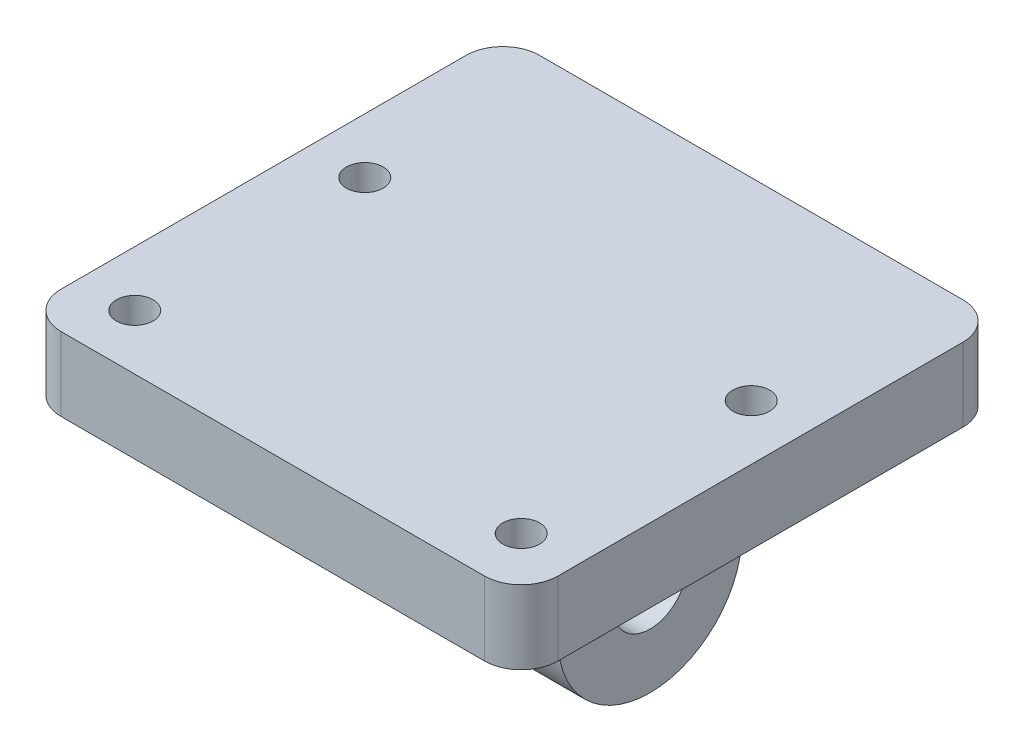
ISO-10303-21;
HEADER;
FILE_DESCRIPTION(('STEP AP214'),'2;1');
FILE_NAME('part.step','',(''),(''),'','','');
FILE_SCHEMA(('AUTOMOTIVE_DESIGN { 1 0 10303 214 1 1 1 1 }'));
ENDSEC;
DATA;
#1=APPLICATION_CONTEXT('core data for automotive mechanical design processes');
#2=APPLICATION_PROTOCOL_DEFINITION('international standard','automotive_design',2000,#1);
#3=PRODUCT_CONTEXT('',#1,'mechanical');
#4=PRODUCT('Part','Part','',(#3));
#5=PRODUCT_RELATED_PRODUCT_CATEGORY('part','',(#4));
#6=PRODUCT_DEFINITION_FORMATION('','',#4);
#7=PRODUCT_DEFINITION_CONTEXT('part definition',#1,'design');
#8=PRODUCT_DEFINITION('design','',#6,#7);
#9=PRODUCT_DEFINITION_SHAPE('','',#8);
#10=(LENGTH_UNIT() NAMED_UNIT(*) SI_UNIT(.MILLI.,.METRE.));
#11=(NAMED_UNIT(*) PLANE_ANGLE_UNIT() SI_UNIT($,.RADIAN.));
#12=(NAMED_UNIT(*) SI_UNIT($,.STERADIAN.) SOLID_ANGLE_UNIT());
#13=UNCERTAINTY_MEASURE_WITH_UNIT(LENGTH_MEASURE(1.E-05),#10,'distance_accuracy_value','');
#14=(GEOMETRIC_REPRESENTATION_CONTEXT(3) GLOBAL_UNCERTAINTY_ASSIGNED_CONTEXT((#13)) GLOBAL_UNIT_ASSIGNED_CONTEXT((#10,
#11,#12)) REPRESENTATION_CONTEXT('',''));
#15=CARTESIAN_POINT('',(0.,0.,0.));
#16=DIRECTION('',(0.,0.,1.));
#17=DIRECTION('',(1.,0.,0.));
#18=AXIS2_PLACEMENT_3D('',#15,#16,#17);
#19=CARTESIAN_POINT('',(0.,0.,0.));
#20=DIRECTION('',(0.,-1.,0.));
#21=DIRECTION('',(0.,0.,-1.));
#22=AXIS2_PLACEMENT_3D('',#19,#20,#21);
#23=PLANE('',#22);
#24=DIRECTION('',(0.,0.,-1.));
#25=VECTOR('',#24,1.);
#26=CARTESIAN_POINT('',(-2.5,0.,0.));
#27=LINE('',#26,#25);
#28=CARTESIAN_POINT('',(-2.5,0.,5.));
#29=VERTEX_POINT('',#28);
#30=CARTESIAN_POINT('',(-2.5,0.,-5.));
#31=VERTEX_POINT('',#30);
#32=EDGE_CURVE('E187',#29,#31,#27,.T.);
#33=ORIENTED_EDGE('',*,*,#32,.T.);
#34=DIRECTION('',(-1.,0.,0.));
#35=VECTOR('',#34,1.);
#36=CARTESIAN_POINT('',(0.,0.,-5.));
#37=LINE('',#36,#35);
#38=CARTESIAN_POINT('',(-7.5,0.,-5.));
#39=VERTEX_POINT('',#38);
#40=EDGE_CURVE('E230',#31,#39,#37,.T.);
#41=ORIENTED_EDGE('',*,*,#40,.T.);
#42=DIRECTION('',(0.,0.,1.));
#43=VECTOR('',#42,1.);
#44=CARTESIAN_POINT('',(-7.5,0.,0.));
#45=LINE('',#44,#43);
#46=CARTESIAN_POINT('',(-7.5,0.,5.));
#47=VERTEX_POINT('',#46);
#48=EDGE_CURVE('E226',#39,#47,#45,.T.);
#49=ORIENTED_EDGE('',*,*,#48,.T.);
#50=DIRECTION('',(-1.,0.,0.));
#51=VECTOR('',#50,1.);
#52=CARTESIAN_POINT('',(0.,0.,5.));
#53=LINE('',#52,#51);
#54=EDGE_CURVE('E222',#29,#47,#53,.T.);
#55=ORIENTED_EDGE('',*,*,#54,.F.);
#56=EDGE_LOOP('',(#33,#41,#49,#55));
#57=FACE_BOUND('',#56,.T.);
#58=CARTESIAN_POINT('',(10.5,0.,-2.5));
#59=DIRECTION('',(0.,1.,0.));
#60=DIRECTION('',(0.,0.,1.));
#61=AXIS2_PLACEMENT_3D('',#58,#59,#60);
#62=CIRCLE('',#61,1.);
#63=CARTESIAN_POINT('',(10.5,0.,-1.5));
#64=VERTEX_POINT('',#63);
#65=EDGE_CURVE('E251',#64,#64,#62,.T.);
#66=ORIENTED_EDGE('',*,*,#65,.T.);
#67=EDGE_LOOP('',(#66));
#68=FACE_BOUND('',#67,.T.);
#69=CARTESIAN_POINT('',(-10.5,0.,-2.5));
#70=DIRECTION('',(0.,1.,0.));
#71=DIRECTION('',(0.,0.,1.));
#72=AXIS2_PLACEMENT_3D('',#69,#70,#71);
#73=CIRCLE('',#72,1.);
#74=CARTESIAN_POINT('',(-10.5,0.,-1.49999999999999));
#75=VERTEX_POINT('',#74);
#76=EDGE_CURVE('E267',#75,#75,#73,.T.);
#77=ORIENTED_EDGE('',*,*,#76,.T.);
#78=EDGE_LOOP('',(#77));
#79=FACE_BOUND('',#78,.T.);
#80=DIRECTION('',(0.,0.,-1.));
#81=VECTOR('',#80,1.);
#82=CARTESIAN_POINT('',(13.5,0.,13.));
#83=LINE('',#82,#81);
#84=CARTESIAN_POINT('',(13.5,0.,11.));
#85=VERTEX_POINT('',#84);
#86=CARTESIAN_POINT('',(13.5,0.,-11.));
#87=VERTEX_POINT('',#86);
#88=EDGE_CURVE('E298',#85,#87,#83,.T.);
#89=ORIENTED_EDGE('',*,*,#88,.F.);
#90=CARTESIAN_POINT('',(11.5,0.,11.));
#91=DIRECTION('',(0.,-1.,0.));
#92=DIRECTION('',(0.,0.,-1.));
#93=AXIS2_PLACEMENT_3D('',#90,#91,#92);
#94=CIRCLE('',#93,2.);
#95=CARTESIAN_POINT('',(11.5,0.,13.));
#96=VERTEX_POINT('',#95);
#97=EDGE_CURVE('E372',#85,#96,#94,.T.);
#98=ORIENTED_EDGE('',*,*,#97,.T.);
#99=DIRECTION('',(1.,0.,0.));
#100=VECTOR('',#99,1.);
#101=CARTESIAN_POINT('',(13.5,0.,13.));
#102=LINE('',#101,#100);
#103=CARTESIAN_POINT('',(-11.5,0.,13.));
#104=VERTEX_POINT('',#103);
#105=EDGE_CURVE('E275',#104,#96,#102,.T.);
#106=ORIENTED_EDGE('',*,*,#105,.F.);
#107=CARTESIAN_POINT('',(-11.5,0.,11.));
#108=DIRECTION('',(0.,-1.,0.));
#109=DIRECTION('',(0.,0.,-1.));
#110=AXIS2_PLACEMENT_3D('',#107,#108,#109);
#111=CIRCLE('',#110,2.);
#112=CARTESIAN_POINT('',(-13.5,0.,11.));
#113=VERTEX_POINT('',#112);
#114=EDGE_CURVE('E369',#104,#113,#111,.T.);
#115=ORIENTED_EDGE('',*,*,#114,.T.);
#116=DIRECTION('',(0.,0.,1.));
#117=VECTOR('',#116,1.);
#118=CARTESIAN_POINT('',(-13.5,0.,13.));
#119=LINE('',#118,#117);
#120=CARTESIAN_POINT('',(-13.5,0.,-11.));
#121=VERTEX_POINT('',#120);
#122=EDGE_CURVE('E284',#121,#113,#119,.T.);
#123=ORIENTED_EDGE('',*,*,#122,.F.);
#124=CARTESIAN_POINT('',(-11.5,0.,-11.));
#125=DIRECTION('',(0.,-1.,0.));
#126=DIRECTION('',(0.,0.,-1.));
#127=AXIS2_PLACEMENT_3D('',#124,#125,#126);
#128=CIRCLE('',#127,2.);
#129=CARTESIAN_POINT('',(-11.5,0.,-13.));
#130=VERTEX_POINT('',#129);
#131=EDGE_CURVE('E366',#121,#130,#128,.T.);
#132=ORIENTED_EDGE('',*,*,#131,.T.);
#133=DIRECTION('',(-1.,0.,0.));
#134=VECTOR('',#133,1.);
#135=CARTESIAN_POINT('',(13.5,0.,-13.));
#136=LINE('',#135,#134);
#137=CARTESIAN_POINT('',(11.5,0.,-13.));
#138=VERTEX_POINT('',#137);
#139=EDGE_CURVE('E302',#138,#130,#136,.T.);
#140=ORIENTED_EDGE('',*,*,#139,.F.);
#141=CARTESIAN_POINT('',(11.5,0.,-11.));
#142=DIRECTION('',(0.,-1.,0.));
#143=DIRECTION('',(0.,0.,-1.));
#144=AXIS2_PLACEMENT_3D('',#141,#142,#143);
#145=CIRCLE('',#144,2.);
#146=EDGE_CURVE('E363',#138,#87,#145,.T.);
#147=ORIENTED_EDGE('',*,*,#146,.T.);
#148=EDGE_LOOP('',(#89,#98,#106,#115,#123,#132,#140,#147));
#149=FACE_BOUND('',#148,.T.);
#150=CARTESIAN_POINT('',(-10.5,0.,10.));
#151=DIRECTION('',(0.,1.,0.));
#152=DIRECTION('',(0.,0.,1.));
#153=AXIS2_PLACEMENT_3D('',#150,#151,#152);
#154=CIRCLE('',#153,1.);
#155=CARTESIAN_POINT('',(-10.5,0.,11.));
#156=VERTEX_POINT('',#155);
#157=EDGE_CURVE('E259',#156,#156,#154,.T.);
#158=ORIENTED_EDGE('',*,*,#157,.T.);
#159=EDGE_LOOP('',(#158));
#160=FACE_BOUND('',#159,.T.);
#161=CARTESIAN_POINT('',(10.5,0.,10.));
#162=DIRECTION('',(0.,1.,0.));
#163=DIRECTION('',(0.,0.,1.));
#164=AXIS2_PLACEMENT_3D('',#161,#162,#163);
#165=CIRCLE('',#164,1.);
#166=CARTESIAN_POINT('',(10.5,0.,11.));
#167=VERTEX_POINT('',#166);
#168=EDGE_CURVE('E246',#167,#167,#165,.T.);
#169=ORIENTED_EDGE('',*,*,#168,.T.);
#170=EDGE_LOOP('',(#169));
#171=FACE_BOUND('',#170,.T.);
#172=DIRECTION('',(0.,0.,-1.));
#173=VECTOR('',#172,1.);
#174=CARTESIAN_POINT('',(2.5,0.,0.));
#175=LINE('',#174,#173);
#176=CARTESIAN_POINT('',(2.5,0.,5.));
#177=VERTEX_POINT('',#176);
#178=CARTESIAN_POINT('',(2.5,0.,-5.));
#179=VERTEX_POINT('',#178);
#180=EDGE_CURVE('E179',#177,#179,#175,.T.);
#181=ORIENTED_EDGE('',*,*,#180,.F.);
#182=DIRECTION('',(-1.,0.,0.));
#183=VECTOR('',#182,1.);
#184=CARTESIAN_POINT('',(0.,0.,5.));
#185=LINE('',#184,#183);
#186=CARTESIAN_POINT('',(7.5,0.,5.));
#187=VERTEX_POINT('',#186);
#188=EDGE_CURVE('E191',#187,#177,#185,.T.);
#189=ORIENTED_EDGE('',*,*,#188,.F.);
#190=DIRECTION('',(0.,0.,1.));
#191=VECTOR('',#190,1.);
#192=CARTESIAN_POINT('',(7.5,0.,0.));
#193=LINE('',#192,#191);
#194=CARTESIAN_POINT('',(7.5,0.,-5.));
#195=VERTEX_POINT('',#194);
#196=EDGE_CURVE('E206',#195,#187,#193,.T.);
#197=ORIENTED_EDGE('',*,*,#196,.F.);
#198=DIRECTION('',(-1.,0.,0.));
#199=VECTOR('',#198,1.);
#200=CARTESIAN_POINT('',(0.,0.,-5.));
#201=LINE('',#200,#199);
#202=EDGE_CURVE('E202',#195,#179,#201,.T.);
#203=ORIENTED_EDGE('',*,*,#202,.T.);
#204=EDGE_LOOP('',(#181,#189,#197,#203));
#205=FACE_BOUND('',#204,.T.);
#206=ADVANCED_FACE('F47',(#57,#68,#79,#149,#160,#171,#205),#23,.T.);
#207=CARTESIAN_POINT('',(0.,4.,0.));
#208=DIRECTION('',(0.,-1.,0.));
#209=DIRECTION('',(0.,0.,-1.));
#210=AXIS2_PLACEMENT_3D('',#207,#208,#209);
#211=PLANE('',#210);
#212=DIRECTION('',(1.,0.,0.));
#213=VECTOR('',#212,1.);
#214=CARTESIAN_POINT('',(13.5,4.,13.));
#215=LINE('',#214,#213);
#216=CARTESIAN_POINT('',(-11.5,4.,13.));
#217=VERTEX_POINT('',#216);
#218=CARTESIAN_POINT('',(11.5,4.,13.));
#219=VERTEX_POINT('',#218);
#220=EDGE_CURVE('E279',#217,#219,#215,.T.);
#221=ORIENTED_EDGE('',*,*,#220,.T.);
#222=CARTESIAN_POINT('',(11.5,4.,11.));
#223=DIRECTION('',(0.,-1.,0.));
#224=DIRECTION('',(0.,0.,-1.));
#225=AXIS2_PLACEMENT_3D('',#222,#223,#224);
#226=CIRCLE('',#225,2.);
#227=CARTESIAN_POINT('',(13.5,4.,11.));
#228=VERTEX_POINT('',#227);
#229=EDGE_CURVE('E390',#219,#228,#226,.F.);
#230=ORIENTED_EDGE('',*,*,#229,.T.);
#231=DIRECTION('',(0.,0.,-1.));
#232=VECTOR('',#231,1.);
#233=CARTESIAN_POINT('',(13.5,4.,13.));
#234=LINE('',#233,#232);
#235=CARTESIAN_POINT('',(13.5,4.,-11.));
#236=VERTEX_POINT('',#235);
#237=EDGE_CURVE('E283',#228,#236,#234,.T.);
#238=ORIENTED_EDGE('',*,*,#237,.T.);
#239=CARTESIAN_POINT('',(11.5,4.,-11.));
#240=DIRECTION('',(0.,-1.,0.));
#241=DIRECTION('',(0.,0.,-1.));
#242=AXIS2_PLACEMENT_3D('',#239,#240,#241);
#243=CIRCLE('',#242,2.);
#244=CARTESIAN_POINT('',(11.5,4.,-13.));
#245=VERTEX_POINT('',#244);
#246=EDGE_CURVE('E382',#236,#245,#243,.F.);
#247=ORIENTED_EDGE('',*,*,#246,.T.);
#248=DIRECTION('',(-1.,0.,0.));
#249=VECTOR('',#248,1.);
#250=CARTESIAN_POINT('',(13.5,4.,-13.));
#251=LINE('',#250,#249);
#252=CARTESIAN_POINT('',(-11.5,4.,-13.));
#253=VERTEX_POINT('',#252);
#254=EDGE_CURVE('E288',#245,#253,#251,.T.);
#255=ORIENTED_EDGE('',*,*,#254,.T.);
#256=CARTESIAN_POINT('',(-11.5,4.,-11.));
#257=DIRECTION('',(0.,-1.,0.));
#258=DIRECTION('',(0.,0.,-1.));
#259=AXIS2_PLACEMENT_3D('',#256,#257,#258);
#260=CIRCLE('',#259,2.);
#261=CARTESIAN_POINT('',(-13.5,4.,-11.));
#262=VERTEX_POINT('',#261);
#263=EDGE_CURVE('E70',#253,#262,#260,.F.);
#264=ORIENTED_EDGE('',*,*,#263,.T.);
#265=DIRECTION('',(0.,0.,1.));
#266=VECTOR('',#265,1.);
#267=CARTESIAN_POINT('',(-13.5,4.,13.));
#268=LINE('',#267,#266);
#269=CARTESIAN_POINT('',(-13.5,4.,11.));
#270=VERTEX_POINT('',#269);
#271=EDGE_CURVE('E291',#262,#270,#268,.T.);
#272=ORIENTED_EDGE('',*,*,#271,.T.);
#273=CARTESIAN_POINT('',(-11.5,4.,11.));
#274=DIRECTION('',(0.,-1.,0.));
#275=DIRECTION('',(0.,0.,-1.));
#276=AXIS2_PLACEMENT_3D('',#273,#274,#275);
#277=CIRCLE('',#276,2.);
#278=EDGE_CURVE('E387',#270,#217,#277,.F.);
#279=ORIENTED_EDGE('',*,*,#278,.T.);
#280=EDGE_LOOP('',(#221,#230,#238,#247,#255,#264,#272,#279));
#281=FACE_BOUND('',#280,.T.);
#282=CARTESIAN_POINT('',(-10.5,4.,-2.5));
#283=DIRECTION('',(0.,1.,0.));
#284=DIRECTION('',(0.,0.,1.));
#285=AXIS2_PLACEMENT_3D('',#282,#283,#284);
#286=CIRCLE('',#285,1.);
#287=CARTESIAN_POINT('',(-10.5,4.,-1.49999999999999));
#288=VERTEX_POINT('',#287);
#289=EDGE_CURVE('E271',#288,#288,#286,.T.);
#290=ORIENTED_EDGE('',*,*,#289,.F.);
#291=EDGE_LOOP('',(#290));
#292=FACE_BOUND('',#291,.T.);
#293=CARTESIAN_POINT('',(-10.5,4.,10.));
#294=DIRECTION('',(0.,1.,0.));
#295=DIRECTION('',(0.,0.,1.));
#296=AXIS2_PLACEMENT_3D('',#293,#294,#295);
#297=CIRCLE('',#296,1.);
#298=CARTESIAN_POINT('',(-10.5,4.,11.));
#299=VERTEX_POINT('',#298);
#300=EDGE_CURVE('E263',#299,#299,#297,.T.);
#301=ORIENTED_EDGE('',*,*,#300,.F.);
#302=EDGE_LOOP('',(#301));
#303=FACE_BOUND('',#302,.T.);
#304=CARTESIAN_POINT('',(10.5,4.,-2.5));
#305=DIRECTION('',(0.,1.,0.));
#306=DIRECTION('',(0.,0.,1.));
#307=AXIS2_PLACEMENT_3D('',#304,#305,#306);
#308=CIRCLE('',#307,1.);
#309=CARTESIAN_POINT('',(10.5,4.,-1.5));
#310=VERTEX_POINT('',#309);
#311=EDGE_CURVE('E255',#310,#310,#308,.T.);
#312=ORIENTED_EDGE('',*,*,#311,.F.);
#313=EDGE_LOOP('',(#312));
#314=FACE_BOUND('',#313,.T.);
#315=CARTESIAN_POINT('',(10.5,4.,10.));
#316=DIRECTION('',(0.,1.,0.));
#317=DIRECTION('',(0.,0.,1.));
#318=AXIS2_PLACEMENT_3D('',#315,#316,#317);
#319=CIRCLE('',#318,1.);
#320=CARTESIAN_POINT('',(10.5,4.,11.));
#321=VERTEX_POINT('',#320);
#322=EDGE_CURVE('E247',#321,#321,#319,.T.);
#323=ORIENTED_EDGE('',*,*,#322,.F.);
#324=EDGE_LOOP('',(#323));
#325=FACE_BOUND('',#324,.T.);
#326=ADVANCED_FACE('F417',(#281,#292,#303,#314,#325),#211,.F.);
#327=CARTESIAN_POINT('',(13.5,4.,13.));
#328=DIRECTION('',(0.,0.,-1.));
#329=DIRECTION('',(-1.,0.,0.));
#330=AXIS2_PLACEMENT_3D('',#327,#328,#329);
#331=PLANE('',#330);
#332=ORIENTED_EDGE('',*,*,#105,.T.);
#333=DIRECTION('',(0.,-1.,0.));
#334=VECTOR('',#333,1.);
#335=CARTESIAN_POINT('',(11.5,4.,13.));
#336=LINE('',#335,#334);
#337=EDGE_CURVE('E379',#96,#219,#336,.F.);
#338=ORIENTED_EDGE('',*,*,#337,.T.);
#339=ORIENTED_EDGE('',*,*,#220,.F.);
#340=DIRECTION('',(0.,-1.,0.));
#341=VECTOR('',#340,1.);
#342=CARTESIAN_POINT('',(-11.5,4.,13.));
#343=LINE('',#342,#341);
#344=EDGE_CURVE('E375',#217,#104,#343,.T.);
#345=ORIENTED_EDGE('',*,*,#344,.T.);
#346=EDGE_LOOP('',(#332,#338,#339,#345));
#347=FACE_BOUND('',#346,.T.);
#348=ADVANCED_FACE('F425',(#347),#331,.F.);
#349=CARTESIAN_POINT('',(13.5,4.,13.));
#350=DIRECTION('',(-1.,0.,0.));
#351=DIRECTION('',(0.,0.,1.));
#352=AXIS2_PLACEMENT_3D('',#349,#350,#351);
#353=PLANE('',#352);
#354=ORIENTED_EDGE('',*,*,#237,.F.);
#355=DIRECTION('',(0.,-1.,0.));
#356=VECTOR('',#355,1.);
#357=CARTESIAN_POINT('',(13.5,4.,11.));
#358=LINE('',#357,#356);
#359=EDGE_CURVE('E359',#228,#85,#358,.T.);
#360=ORIENTED_EDGE('',*,*,#359,.T.);
#361=ORIENTED_EDGE('',*,*,#88,.T.);
#362=DIRECTION('',(0.,-1.,0.));
#363=VECTOR('',#362,1.);
#364=CARTESIAN_POINT('',(13.5,4.,-11.));
#365=LINE('',#364,#363);
#366=EDGE_CURVE('E343',#87,#236,#365,.F.);
#367=ORIENTED_EDGE('',*,*,#366,.T.);
#368=EDGE_LOOP('',(#354,#360,#361,#367));
#369=FACE_BOUND('',#368,.T.);
#370=ADVANCED_FACE('F433',(#369),#353,.F.);
#371=CARTESIAN_POINT('',(13.5,4.,-13.));
#372=DIRECTION('',(0.,0.,1.));
#373=DIRECTION('',(1.,0.,0.));
#374=AXIS2_PLACEMENT_3D('',#371,#372,#373);
#375=PLANE('',#374);
#376=ORIENTED_EDGE('',*,*,#139,.T.);
#377=DIRECTION('',(0.,-1.,0.));
#378=VECTOR('',#377,1.);
#379=CARTESIAN_POINT('',(-11.5,4.,-13.));
#380=LINE('',#379,#378);
#381=EDGE_CURVE('E11',#130,#253,#380,.F.);
#382=ORIENTED_EDGE('',*,*,#381,.T.);
#383=ORIENTED_EDGE('',*,*,#254,.F.);
#384=DIRECTION('',(0.,-1.,0.));
#385=VECTOR('',#384,1.);
#386=CARTESIAN_POINT('',(11.5,4.,-13.));
#387=LINE('',#386,#385);
#388=EDGE_CURVE('E56',#245,#138,#387,.T.);
#389=ORIENTED_EDGE('',*,*,#388,.T.);
#390=EDGE_LOOP('',(#376,#382,#383,#389));
#391=FACE_BOUND('',#390,.T.);
#392=ADVANCED_FACE('F404',(#391),#375,.F.);
#393=CARTESIAN_POINT('',(-13.5,4.,13.));
#394=DIRECTION('',(1.,0.,0.));
#395=DIRECTION('',(0.,0.,-1.));
#396=AXIS2_PLACEMENT_3D('',#393,#394,#395);
#397=PLANE('',#396);
#398=ORIENTED_EDGE('',*,*,#122,.T.);
#399=DIRECTION('',(0.,-1.,0.));
#400=VECTOR('',#399,1.);
#401=CARTESIAN_POINT('',(-13.5,4.,11.));
#402=LINE('',#401,#400);
#403=EDGE_CURVE('E63',#113,#270,#402,.F.);
#404=ORIENTED_EDGE('',*,*,#403,.T.);
#405=ORIENTED_EDGE('',*,*,#271,.F.);
#406=DIRECTION('',(0.,-1.,0.));
#407=VECTOR('',#406,1.);
#408=CARTESIAN_POINT('',(-13.5,4.,-11.));
#409=LINE('',#408,#407);
#410=EDGE_CURVE('E393',#262,#121,#409,.T.);
#411=ORIENTED_EDGE('',*,*,#410,.T.);
#412=EDGE_LOOP('',(#398,#404,#405,#411));
#413=FACE_BOUND('',#412,.T.);
#414=ADVANCED_FACE('F415',(#413),#397,.F.);
#415=CARTESIAN_POINT('',(-10.5,4.,-2.5));
#416=DIRECTION('',(0.,-1.,0.));
#417=DIRECTION('',(0.,0.,-1.));
#418=AXIS2_PLACEMENT_3D('',#415,#416,#417);
#419=CYLINDRICAL_SURFACE('',#418,1.);
#420=ORIENTED_EDGE('',*,*,#289,.T.);
#421=EDGE_LOOP('',(#420));
#422=FACE_BOUND('',#421,.T.);
#423=ORIENTED_EDGE('',*,*,#76,.F.);
#424=EDGE_LOOP('',(#423));
#425=FACE_BOUND('',#424,.T.);
#426=ADVANCED_FACE('F453',(#422,#425),#419,.F.);
#427=CARTESIAN_POINT('',(-10.5,4.,10.));
#428=DIRECTION('',(0.,-1.,0.));
#429=DIRECTION('',(0.,0.,-1.));
#430=AXIS2_PLACEMENT_3D('',#427,#428,#429);
#431=CYLINDRICAL_SURFACE('',#430,1.);
#432=ORIENTED_EDGE('',*,*,#300,.T.);
#433=EDGE_LOOP('',(#432));
#434=FACE_BOUND('',#433,.T.);
#435=ORIENTED_EDGE('',*,*,#157,.F.);
#436=EDGE_LOOP('',(#435));
#437=FACE_BOUND('',#436,.T.);
#438=ADVANCED_FACE('F625',(#434,#437),#431,.F.);
#439=CARTESIAN_POINT('',(10.5,4.,-2.5));
#440=DIRECTION('',(0.,-1.,0.));
#441=DIRECTION('',(0.,0.,-1.));
#442=AXIS2_PLACEMENT_3D('',#439,#440,#441);
#443=CYLINDRICAL_SURFACE('',#442,1.);
#444=ORIENTED_EDGE('',*,*,#311,.T.);
#445=EDGE_LOOP('',(#444));
#446=FACE_BOUND('',#445,.T.);
#447=ORIENTED_EDGE('',*,*,#65,.F.);
#448=EDGE_LOOP('',(#447));
#449=FACE_BOUND('',#448,.T.);
#450=ADVANCED_FACE('F616',(#446,#449),#443,.F.);
#451=CARTESIAN_POINT('',(10.5,4.,10.));
#452=DIRECTION('',(0.,-1.,0.));
#453=DIRECTION('',(0.,0.,-1.));
#454=AXIS2_PLACEMENT_3D('',#451,#452,#453);
#455=CYLINDRICAL_SURFACE('',#454,1.);
#456=ORIENTED_EDGE('',*,*,#322,.T.);
#457=EDGE_LOOP('',(#456));
#458=FACE_BOUND('',#457,.T.);
#459=ORIENTED_EDGE('',*,*,#168,.F.);
#460=EDGE_LOOP('',(#459));
#461=FACE_BOUND('',#460,.T.);
#462=ADVANCED_FACE('F602',(#458,#461),#455,.F.);
#463=CARTESIAN_POINT('',(-2.5,-10.,0.));
#464=DIRECTION('',(1.,0.,0.));
#465=DIRECTION('',(0.,0.,-1.));
#466=AXIS2_PLACEMENT_3D('',#463,#464,#465);
#467=PLANE('',#466);
#468=CARTESIAN_POINT('',(-2.5,-5.,0.));
#469=DIRECTION('',(1.,0.,0.));
#470=DIRECTION('',(0.,0.,-1.));
#471=AXIS2_PLACEMENT_3D('',#468,#469,#470);
#472=CIRCLE('',#471,2.);
#473=CARTESIAN_POINT('',(-2.5,-5.,-2.));
#474=VERTEX_POINT('',#473);
#475=EDGE_CURVE('E351',#474,#474,#472,.F.);
#476=ORIENTED_EDGE('',*,*,#475,.T.);
#477=EDGE_LOOP('',(#476));
#478=FACE_BOUND('',#477,.T.);
#479=DIRECTION('',(0.,1.,0.));
#480=VECTOR('',#479,1.);
#481=CARTESIAN_POINT('',(-2.5,-10.,5.));
#482=LINE('',#481,#480);
#483=CARTESIAN_POINT('',(-2.5,-5.,5.));
#484=VERTEX_POINT('',#483);
#485=EDGE_CURVE('E243',#484,#29,#482,.T.);
#486=ORIENTED_EDGE('',*,*,#485,.F.);
#487=CARTESIAN_POINT('',(-2.5,-5.,0.));
#488=DIRECTION('',(1.,0.,0.));
#489=DIRECTION('',(0.,0.,-1.));
#490=AXIS2_PLACEMENT_3D('',#487,#488,#489);
#491=CIRCLE('',#490,5.);
#492=CARTESIAN_POINT('',(-2.5,-10.,0.));
#493=VERTEX_POINT('',#492);
#494=EDGE_CURVE('E337',#484,#493,#491,.T.);
#495=ORIENTED_EDGE('',*,*,#494,.T.);
#496=CARTESIAN_POINT('',(-2.5,-5.,0.));
#497=DIRECTION('',(1.,0.,0.));
#498=DIRECTION('',(0.,0.,-1.));
#499=AXIS2_PLACEMENT_3D('',#496,#497,#498);
#500=CIRCLE('',#499,5.);
#501=CARTESIAN_POINT('',(-2.5,-5.,-5.));
#502=VERTEX_POINT('',#501);
#503=EDGE_CURVE('E334',#493,#502,#500,.T.);
#504=ORIENTED_EDGE('',*,*,#503,.T.);
#505=DIRECTION('',(0.,1.,0.));
#506=VECTOR('',#505,1.);
#507=CARTESIAN_POINT('',(-2.5,-10.,-5.));
#508=LINE('',#507,#506);
#509=EDGE_CURVE('E234',#502,#31,#508,.T.);
#510=ORIENTED_EDGE('',*,*,#509,.T.);
#511=ORIENTED_EDGE('',*,*,#32,.F.);
#512=EDGE_LOOP('',(#486,#495,#504,#510,#511));
#513=FACE_BOUND('',#512,.T.);
#514=ADVANCED_FACE('F594',(#478,#513),#467,.T.);
#515=CARTESIAN_POINT('',(0.,-10.,5.));
#516=DIRECTION('',(0.,0.,-1.));
#517=DIRECTION('',(-1.,0.,0.));
#518=AXIS2_PLACEMENT_3D('',#515,#516,#517);
#519=PLANE('',#518);
#520=DIRECTION('',(0.,1.,0.));
#521=VECTOR('',#520,1.);
#522=CARTESIAN_POINT('',(-7.5,-10.,5.));
#523=LINE('',#522,#521);
#524=CARTESIAN_POINT('',(-7.5,-5.,5.));
#525=VERTEX_POINT('',#524);
#526=EDGE_CURVE('E240',#525,#47,#523,.T.);
#527=ORIENTED_EDGE('',*,*,#526,.F.);
#528=DIRECTION('',(-1.,0.,0.));
#529=VECTOR('',#528,1.);
#530=CARTESIAN_POINT('',(-2.5,-5.,5.));
#531=LINE('',#530,#529);
#532=EDGE_CURVE('E330',#525,#484,#531,.F.);
#533=ORIENTED_EDGE('',*,*,#532,.T.);
#534=ORIENTED_EDGE('',*,*,#485,.T.);
#535=ORIENTED_EDGE('',*,*,#54,.T.);
#536=EDGE_LOOP('',(#527,#533,#534,#535));
#537=FACE_BOUND('',#536,.T.);
#538=ADVANCED_FACE('F585',(#537),#519,.F.);
#539=CARTESIAN_POINT('',(-7.5,-10.,0.));
#540=DIRECTION('',(-1.,0.,0.));
#541=DIRECTION('',(0.,0.,1.));
#542=AXIS2_PLACEMENT_3D('',#539,#540,#541);
#543=PLANE('',#542);
#544=CARTESIAN_POINT('',(-7.5,-5.,0.));
#545=DIRECTION('',(-1.,0.,0.));
#546=DIRECTION('',(0.,0.,1.));
#547=AXIS2_PLACEMENT_3D('',#544,#545,#546);
#548=CIRCLE('',#547,2.);
#549=CARTESIAN_POINT('',(-7.5,-5.,2.));
#550=VERTEX_POINT('',#549);
#551=EDGE_CURVE('E729',#550,#550,#548,.F.);
#552=ORIENTED_EDGE('',*,*,#551,.T.);
#553=EDGE_LOOP('',(#552));
#554=FACE_BOUND('',#553,.T.);
#555=CARTESIAN_POINT('',(-7.5,-5.,0.));
#556=DIRECTION('',(-1.,0.,0.));
#557=DIRECTION('',(0.,0.,1.));
#558=AXIS2_PLACEMENT_3D('',#555,#556,#557);
#559=CIRCLE('',#558,5.);
#560=CARTESIAN_POINT('',(-7.5,-5.,-5.));
#561=VERTEX_POINT('',#560);
#562=CARTESIAN_POINT('',(-7.5,-10.,0.));
#563=VERTEX_POINT('',#562);
#564=EDGE_CURVE('E324',#561,#563,#559,.T.);
#565=ORIENTED_EDGE('',*,*,#564,.T.);
#566=CARTESIAN_POINT('',(-7.5,-5.,0.));
#567=DIRECTION('',(-1.,0.,0.));
#568=DIRECTION('',(0.,0.,1.));
#569=AXIS2_PLACEMENT_3D('',#566,#567,#568);
#570=CIRCLE('',#569,5.);
#571=EDGE_CURVE('E327',#563,#525,#570,.T.);
#572=ORIENTED_EDGE('',*,*,#571,.T.);
#573=ORIENTED_EDGE('',*,*,#526,.T.);
#574=ORIENTED_EDGE('',*,*,#48,.F.);
#575=DIRECTION('',(0.,1.,0.));
#576=VECTOR('',#575,1.);
#577=CARTESIAN_POINT('',(-7.5,-10.,-5.));
#578=LINE('',#577,#576);
#579=EDGE_CURVE('E237',#561,#39,#578,.T.);
#580=ORIENTED_EDGE('',*,*,#579,.F.);
#581=EDGE_LOOP('',(#565,#572,#573,#574,#580));
#582=FACE_BOUND('',#581,.T.);
#583=ADVANCED_FACE('F576',(#554,#582),#543,.T.);
#584=CARTESIAN_POINT('',(0.,-10.,-5.));
#585=DIRECTION('',(0.,0.,-1.));
#586=DIRECTION('',(-1.,0.,0.));
#587=AXIS2_PLACEMENT_3D('',#584,#585,#586);
#588=PLANE('',#587);
#589=ORIENTED_EDGE('',*,*,#509,.F.);
#590=DIRECTION('',(-1.,0.,0.));
#591=VECTOR('',#590,1.);
#592=CARTESIAN_POINT('',(0.,-5.,-5.));
#593=LINE('',#592,#591);
#594=EDGE_CURVE('E340',#502,#561,#593,.T.);
#595=ORIENTED_EDGE('',*,*,#594,.T.);
#596=ORIENTED_EDGE('',*,*,#579,.T.);
#597=ORIENTED_EDGE('',*,*,#40,.F.);
#598=EDGE_LOOP('',(#589,#595,#596,#597));
#599=FACE_BOUND('',#598,.T.);
#600=ADVANCED_FACE('F568',(#599),#588,.T.);
#601=CARTESIAN_POINT('',(0.,-10.,5.));
#602=DIRECTION('',(0.,0.,-1.));
#603=DIRECTION('',(-1.,0.,0.));
#604=AXIS2_PLACEMENT_3D('',#601,#602,#603);
#605=PLANE('',#604);
#606=DIRECTION('',(0.,1.,0.));
#607=VECTOR('',#606,1.);
#608=CARTESIAN_POINT('',(2.5,-10.,5.));
#609=LINE('',#608,#607);
#610=CARTESIAN_POINT('',(2.5,-5.,5.));
#611=VERTEX_POINT('',#610);
#612=EDGE_CURVE('E174',#611,#177,#609,.T.);
#613=ORIENTED_EDGE('',*,*,#612,.F.);
#614=DIRECTION('',(-1.,0.,0.));
#615=VECTOR('',#614,1.);
#616=CARTESIAN_POINT('',(7.5,-5.,5.));
#617=LINE('',#616,#615);
#618=CARTESIAN_POINT('',(7.5,-5.,5.));
#619=VERTEX_POINT('',#618);
#620=EDGE_CURVE('E312',#611,#619,#617,.F.);
#621=ORIENTED_EDGE('',*,*,#620,.T.);
#622=DIRECTION('',(0.,1.,0.));
#623=VECTOR('',#622,1.);
#624=CARTESIAN_POINT('',(7.5,-10.,5.));
#625=LINE('',#624,#623);
#626=EDGE_CURVE('E194',#619,#187,#625,.T.);
#627=ORIENTED_EDGE('',*,*,#626,.T.);
#628=ORIENTED_EDGE('',*,*,#188,.T.);
#629=EDGE_LOOP('',(#613,#621,#627,#628));
#630=FACE_BOUND('',#629,.T.);
#631=ADVANCED_FACE('F192',(#630),#605,.F.);
#632=CARTESIAN_POINT('',(2.5,-10.,0.));
#633=DIRECTION('',(1.,0.,0.));
#634=DIRECTION('',(0.,0.,-1.));
#635=AXIS2_PLACEMENT_3D('',#632,#633,#634);
#636=PLANE('',#635);
#637=CARTESIAN_POINT('',(2.5,-5.,0.));
#638=DIRECTION('',(1.,0.,0.));
#639=DIRECTION('',(0.,0.,-1.));
#640=AXIS2_PLACEMENT_3D('',#637,#638,#639);
#641=CIRCLE('',#640,2.);
#642=CARTESIAN_POINT('',(2.5,-5.,-2.));
#643=VERTEX_POINT('',#642);
#644=EDGE_CURVE('E356',#643,#643,#641,.F.);
#645=ORIENTED_EDGE('',*,*,#644,.F.);
#646=EDGE_LOOP('',(#645));
#647=FACE_BOUND('',#646,.T.);
#648=CARTESIAN_POINT('',(2.5,-5.,0.));
#649=DIRECTION('',(1.,0.,0.));
#650=DIRECTION('',(0.,0.,-1.));
#651=AXIS2_PLACEMENT_3D('',#648,#649,#650);
#652=CIRCLE('',#651,5.);
#653=CARTESIAN_POINT('',(2.5,-5.,-5.));
#654=VERTEX_POINT('',#653);
#655=CARTESIAN_POINT('',(2.5,-10.,0.));
#656=VERTEX_POINT('',#655);
#657=EDGE_CURVE('E294',#654,#656,#652,.F.);
#658=ORIENTED_EDGE('',*,*,#657,.T.);
#659=CARTESIAN_POINT('',(2.5,-5.,0.));
#660=DIRECTION('',(1.,0.,0.));
#661=DIRECTION('',(0.,0.,-1.));
#662=AXIS2_PLACEMENT_3D('',#659,#660,#661);
#663=CIRCLE('',#662,5.);
#664=EDGE_CURVE('E182',#656,#611,#663,.F.);
#665=ORIENTED_EDGE('',*,*,#664,.T.);
#666=ORIENTED_EDGE('',*,*,#612,.T.);
#667=ORIENTED_EDGE('',*,*,#180,.T.);
#668=DIRECTION('',(0.,1.,0.));
#669=VECTOR('',#668,1.);
#670=CARTESIAN_POINT('',(2.5,-10.,-5.));
#671=LINE('',#670,#669);
#672=EDGE_CURVE('E188',#654,#179,#671,.T.);
#673=ORIENTED_EDGE('',*,*,#672,.F.);
#674=EDGE_LOOP('',(#658,#665,#666,#667,#673));
#675=FACE_BOUND('',#674,.T.);
#676=ADVANCED_FACE('F176',(#647,#675),#636,.F.);
#677=CARTESIAN_POINT('',(0.,-10.,-5.));
#678=DIRECTION('',(0.,0.,-1.));
#679=DIRECTION('',(-1.,0.,0.));
#680=AXIS2_PLACEMENT_3D('',#677,#678,#679);
#681=PLANE('',#680);
#682=DIRECTION('',(0.,1.,0.));
#683=VECTOR('',#682,1.);
#684=CARTESIAN_POINT('',(7.5,-10.,-5.));
#685=LINE('',#684,#683);
#686=CARTESIAN_POINT('',(7.5,-5.,-5.));
#687=VERTEX_POINT('',#686);
#688=EDGE_CURVE('E214',#687,#195,#685,.T.);
#689=ORIENTED_EDGE('',*,*,#688,.F.);
#690=DIRECTION('',(-1.,0.,0.));
#691=VECTOR('',#690,1.);
#692=CARTESIAN_POINT('',(0.,-5.,-5.));
#693=LINE('',#692,#691);
#694=EDGE_CURVE('E321',#687,#654,#693,.T.);
#695=ORIENTED_EDGE('',*,*,#694,.T.);
#696=ORIENTED_EDGE('',*,*,#672,.T.);
#697=ORIENTED_EDGE('',*,*,#202,.F.);
#698=EDGE_LOOP('',(#689,#695,#696,#697));
#699=FACE_BOUND('',#698,.T.);
#700=ADVANCED_FACE('F543',(#699),#681,.T.);
#701=CARTESIAN_POINT('',(7.5,-10.,0.));
#702=DIRECTION('',(-1.,0.,0.));
#703=DIRECTION('',(0.,0.,1.));
#704=AXIS2_PLACEMENT_3D('',#701,#702,#703);
#705=PLANE('',#704);
#706=CARTESIAN_POINT('',(7.5,-5.,0.));
#707=DIRECTION('',(-1.,0.,0.));
#708=DIRECTION('',(0.,0.,1.));
#709=AXIS2_PLACEMENT_3D('',#706,#707,#708);
#710=CIRCLE('',#709,2.);
#711=CARTESIAN_POINT('',(7.5,-5.,2.));
#712=VERTEX_POINT('',#711);
#713=EDGE_CURVE('E352',#712,#712,#710,.F.);
#714=ORIENTED_EDGE('',*,*,#713,.F.);
#715=EDGE_LOOP('',(#714));
#716=FACE_BOUND('',#715,.T.);
#717=ORIENTED_EDGE('',*,*,#626,.F.);
#718=CARTESIAN_POINT('',(7.5,-5.,0.));
#719=DIRECTION('',(-1.,0.,0.));
#720=DIRECTION('',(0.,0.,1.));
#721=AXIS2_PLACEMENT_3D('',#718,#719,#720);
#722=CIRCLE('',#721,5.);
#723=CARTESIAN_POINT('',(7.5,-10.,0.));
#724=VERTEX_POINT('',#723);
#725=EDGE_CURVE('E318',#619,#724,#722,.F.);
#726=ORIENTED_EDGE('',*,*,#725,.T.);
#727=CARTESIAN_POINT('',(7.5,-5.,0.));
#728=DIRECTION('',(-1.,0.,0.));
#729=DIRECTION('',(0.,0.,1.));
#730=AXIS2_PLACEMENT_3D('',#727,#728,#729);
#731=CIRCLE('',#730,5.);
#732=EDGE_CURVE('E315',#724,#687,#731,.F.);
#733=ORIENTED_EDGE('',*,*,#732,.T.);
#734=ORIENTED_EDGE('',*,*,#688,.T.);
#735=ORIENTED_EDGE('',*,*,#196,.T.);
#736=EDGE_LOOP('',(#717,#726,#733,#734,#735));
#737=FACE_BOUND('',#736,.T.);
#738=ADVANCED_FACE('F468',(#716,#737),#705,.F.);
#739=CARTESIAN_POINT('',(0.,-5.,0.));
#740=DIRECTION('',(-1.,0.,0.));
#741=DIRECTION('',(0.,0.,1.));
#742=AXIS2_PLACEMENT_3D('',#739,#740,#741);
#743=CYLINDRICAL_SURFACE('',#742,5.);
#744=ORIENTED_EDGE('',*,*,#694,.F.);
#745=ORIENTED_EDGE('',*,*,#732,.F.);
#746=DIRECTION('',(-1.,0.,0.));
#747=VECTOR('',#746,1.);
#748=CARTESIAN_POINT('',(0.,-10.,0.));
#749=LINE('',#748,#747);
#750=EDGE_CURVE('E199',#656,#724,#749,.F.);
#751=ORIENTED_EDGE('',*,*,#750,.F.);
#752=ORIENTED_EDGE('',*,*,#657,.F.);
#753=EDGE_LOOP('',(#744,#745,#751,#752));
#754=FACE_BOUND('',#753,.T.);
#755=ADVANCED_FACE('F464',(#754),#743,.T.);
#756=CARTESIAN_POINT('',(0.,-5.,0.));
#757=DIRECTION('',(1.,0.,0.));
#758=DIRECTION('',(0.,0.,-1.));
#759=AXIS2_PLACEMENT_3D('',#756,#757,#758);
#760=CYLINDRICAL_SURFACE('',#759,5.);
#761=ORIENTED_EDGE('',*,*,#725,.F.);
#762=ORIENTED_EDGE('',*,*,#620,.F.);
#763=ORIENTED_EDGE('',*,*,#664,.F.);
#764=ORIENTED_EDGE('',*,*,#750,.T.);
#765=EDGE_LOOP('',(#761,#762,#763,#764));
#766=FACE_BOUND('',#765,.T.);
#767=ADVANCED_FACE('F460',(#766),#760,.T.);
#768=CARTESIAN_POINT('',(0.,-5.,0.));
#769=DIRECTION('',(-1.,0.,0.));
#770=DIRECTION('',(0.,0.,1.));
#771=AXIS2_PLACEMENT_3D('',#768,#769,#770);
#772=CYLINDRICAL_SURFACE('',#771,5.);
#773=ORIENTED_EDGE('',*,*,#594,.F.);
#774=ORIENTED_EDGE('',*,*,#503,.F.);
#775=DIRECTION('',(-1.,0.,0.));
#776=VECTOR('',#775,1.);
#777=CARTESIAN_POINT('',(0.,-10.,0.));
#778=LINE('',#777,#776);
#779=EDGE_CURVE('E347',#563,#493,#778,.F.);
#780=ORIENTED_EDGE('',*,*,#779,.F.);
#781=ORIENTED_EDGE('',*,*,#564,.F.);
#782=EDGE_LOOP('',(#773,#774,#780,#781));
#783=FACE_BOUND('',#782,.T.);
#784=ADVANCED_FACE('F463',(#783),#772,.T.);
#785=CARTESIAN_POINT('',(0.,-5.,0.));
#786=DIRECTION('',(1.,0.,0.));
#787=DIRECTION('',(0.,0.,-1.));
#788=AXIS2_PLACEMENT_3D('',#785,#786,#787);
#789=CYLINDRICAL_SURFACE('',#788,5.);
#790=ORIENTED_EDGE('',*,*,#494,.F.);
#791=ORIENTED_EDGE('',*,*,#532,.F.);
#792=ORIENTED_EDGE('',*,*,#571,.F.);
#793=ORIENTED_EDGE('',*,*,#779,.T.);
#794=EDGE_LOOP('',(#790,#791,#792,#793));
#795=FACE_BOUND('',#794,.T.);
#796=ADVANCED_FACE('F470',(#795),#789,.T.);
#797=CARTESIAN_POINT('',(-18.5,-5.,0.));
#798=DIRECTION('',(1.,0.,0.));
#799=DIRECTION('',(0.,0.,-1.));
#800=AXIS2_PLACEMENT_3D('',#797,#798,#799);
#801=CYLINDRICAL_SURFACE('',#800,2.);
#802=ORIENTED_EDGE('',*,*,#713,.T.);
#803=EDGE_LOOP('',(#802));
#804=FACE_BOUND('',#803,.T.);
#805=ORIENTED_EDGE('',*,*,#644,.T.);
#806=EDGE_LOOP('',(#805));
#807=FACE_BOUND('',#806,.T.);
#808=ADVANCED_FACE('F473',(#804,#807),#801,.F.);
#809=ORIENTED_EDGE('',*,*,#475,.F.);
#810=EDGE_LOOP('',(#809));
#811=FACE_BOUND('',#810,.T.);
#812=ORIENTED_EDGE('',*,*,#551,.F.);
#813=EDGE_LOOP('',(#812));
#814=FACE_BOUND('',#813,.T.);
#815=ADVANCED_FACE('F480',(#811,#814),#801,.F.);
#816=CARTESIAN_POINT('',(11.5,4.,11.));
#817=DIRECTION('',(0.,-1.,0.));
#818=DIRECTION('',(0.,0.,-1.));
#819=AXIS2_PLACEMENT_3D('',#816,#817,#818);
#820=CYLINDRICAL_SURFACE('',#819,2.);
#821=ORIENTED_EDGE('',*,*,#229,.F.);
#822=ORIENTED_EDGE('',*,*,#337,.F.);
#823=ORIENTED_EDGE('',*,*,#97,.F.);
#824=ORIENTED_EDGE('',*,*,#359,.F.);
#825=EDGE_LOOP('',(#821,#822,#823,#824));
#826=FACE_BOUND('',#825,.T.);
#827=ADVANCED_FACE('F430',(#826),#820,.T.);
#828=CARTESIAN_POINT('',(-11.5,4.,11.));
#829=DIRECTION('',(0.,-1.,0.));
#830=DIRECTION('',(0.,0.,-1.));
#831=AXIS2_PLACEMENT_3D('',#828,#829,#830);
#832=CYLINDRICAL_SURFACE('',#831,2.);
#833=ORIENTED_EDGE('',*,*,#278,.F.);
#834=ORIENTED_EDGE('',*,*,#403,.F.);
#835=ORIENTED_EDGE('',*,*,#114,.F.);
#836=ORIENTED_EDGE('',*,*,#344,.F.);
#837=EDGE_LOOP('',(#833,#834,#835,#836));
#838=FACE_BOUND('',#837,.T.);
#839=ADVANCED_FACE('F422',(#838),#832,.T.);
#840=CARTESIAN_POINT('',(-11.5,4.,-11.));
#841=DIRECTION('',(0.,-1.,0.));
#842=DIRECTION('',(0.,0.,-1.));
#843=AXIS2_PLACEMENT_3D('',#840,#841,#842);
#844=CYLINDRICAL_SURFACE('',#843,2.);
#845=ORIENTED_EDGE('',*,*,#263,.F.);
#846=ORIENTED_EDGE('',*,*,#381,.F.);
#847=ORIENTED_EDGE('',*,*,#131,.F.);
#848=ORIENTED_EDGE('',*,*,#410,.F.);
#849=EDGE_LOOP('',(#845,#846,#847,#848));
#850=FACE_BOUND('',#849,.T.);
#851=ADVANCED_FACE('F414',(#850),#844,.T.);
#852=CARTESIAN_POINT('',(11.5,4.,-11.));
#853=DIRECTION('',(0.,-1.,0.));
#854=DIRECTION('',(0.,0.,-1.));
#855=AXIS2_PLACEMENT_3D('',#852,#853,#854);
#856=CYLINDRICAL_SURFACE('',#855,2.);
#857=ORIENTED_EDGE('',*,*,#246,.F.);
#858=ORIENTED_EDGE('',*,*,#366,.F.);
#859=ORIENTED_EDGE('',*,*,#146,.F.);
#860=ORIENTED_EDGE('',*,*,#388,.F.);
#861=EDGE_LOOP('',(#857,#858,#859,#860));
#862=FACE_BOUND('',#861,.T.);
#863=ADVANCED_FACE('F49',(#862),#856,.T.);
#864=CLOSED_SHELL('',(#206,#326,#348,#370,#392,#414,#426,#438,#450,#462,#514,#538,#583,#600,
#631,#676,#700,#738,#755,#767,#784,#796,#808,#815,#827,#839,#851,#863));
#865=MANIFOLD_SOLID_BREP('B2',#864);
#866=ADVANCED_BREP_SHAPE_REPRESENTATION('',(#18,#865),#14);
#867=SHAPE_DEFINITION_REPRESENTATION(#9,#866);
ENDSEC;
END-ISO-10303-21;
